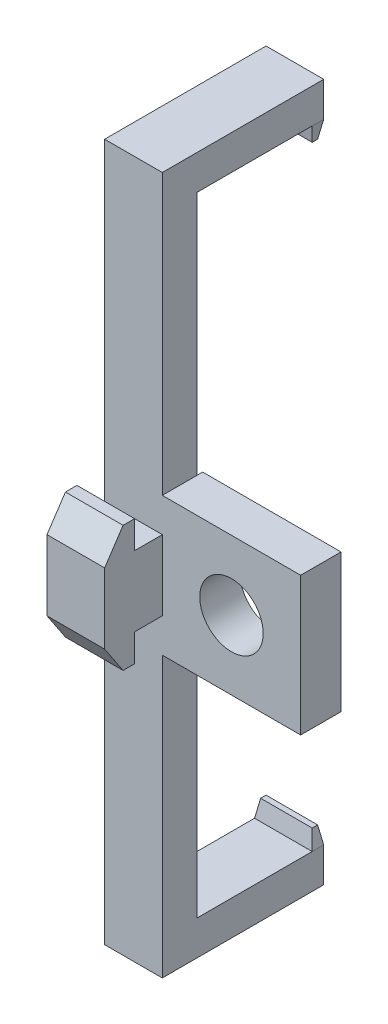
ISO-10303-21;
HEADER;
FILE_DESCRIPTION(('STEP AP214'),'2;1');
FILE_NAME('part.step','',(''),(''),'','','');
FILE_SCHEMA(('AUTOMOTIVE_DESIGN { 1 0 10303 214 1 1 1 1 }'));
ENDSEC;
DATA;
#1=APPLICATION_CONTEXT('core data for automotive mechanical design processes');
#2=APPLICATION_PROTOCOL_DEFINITION('international standard','automotive_design',2000,#1);
#3=PRODUCT_CONTEXT('',#1,'mechanical');
#4=PRODUCT('Part','Part','',(#3));
#5=PRODUCT_RELATED_PRODUCT_CATEGORY('part','',(#4));
#6=PRODUCT_DEFINITION_FORMATION('','',#4);
#7=PRODUCT_DEFINITION_CONTEXT('part definition',#1,'design');
#8=PRODUCT_DEFINITION('design','',#6,#7);
#9=PRODUCT_DEFINITION_SHAPE('','',#8);
#10=(LENGTH_UNIT() NAMED_UNIT(*) SI_UNIT(.MILLI.,.METRE.));
#11=(NAMED_UNIT(*) PLANE_ANGLE_UNIT() SI_UNIT($,.RADIAN.));
#12=(NAMED_UNIT(*) SI_UNIT($,.STERADIAN.) SOLID_ANGLE_UNIT());
#13=UNCERTAINTY_MEASURE_WITH_UNIT(LENGTH_MEASURE(1.E-05),#10,'distance_accuracy_value','');
#14=(GEOMETRIC_REPRESENTATION_CONTEXT(3) GLOBAL_UNCERTAINTY_ASSIGNED_CONTEXT((#13)) GLOBAL_UNIT_ASSIGNED_CONTEXT((#10,
#11,#12)) REPRESENTATION_CONTEXT('',''));
#15=CARTESIAN_POINT('',(0.,0.,0.));
#16=DIRECTION('',(0.,0.,1.));
#17=DIRECTION('',(1.,0.,0.));
#18=AXIS2_PLACEMENT_3D('',#15,#16,#17);
#19=CARTESIAN_POINT('',(-75.5113721841337,0.,3.));
#20=DIRECTION('',(-1.,0.,0.));
#21=DIRECTION('',(0.,0.,1.));
#22=AXIS2_PLACEMENT_3D('',#19,#20,#21);
#23=PLANE('',#22);
#24=DIRECTION('',(0.,0.,-1.));
#25=VECTOR('',#24,1.);
#26=CARTESIAN_POINT('',(-75.5113721841337,-6.,3.));
#27=LINE('',#26,#25);
#28=CARTESIAN_POINT('',(-75.5113721841337,-6.,3.));
#29=VERTEX_POINT('',#28);
#30=CARTESIAN_POINT('',(-75.5113721841337,-6.,0.));
#31=VERTEX_POINT('',#30);
#32=EDGE_CURVE('E256',#29,#31,#27,.T.);
#33=ORIENTED_EDGE('',*,*,#32,.F.);
#34=DIRECTION('',(0.,1.,0.));
#35=VECTOR('',#34,1.);
#36=CARTESIAN_POINT('',(-75.5113721841337,0.,3.));
#37=LINE('',#36,#35);
#38=CARTESIAN_POINT('',(-75.5113721841337,-30.25,3.));
#39=VERTEX_POINT('',#38);
#40=EDGE_CURVE('E439',#39,#29,#37,.T.);
#41=ORIENTED_EDGE('',*,*,#40,.F.);
#42=DIRECTION('',(0.,0.,-1.));
#43=VECTOR('',#42,1.);
#44=CARTESIAN_POINT('',(-75.5113721841337,-30.25,3.));
#45=LINE('',#44,#43);
#46=CARTESIAN_POINT('',(-75.5113721841337,-30.25,-11.));
#47=VERTEX_POINT('',#46);
#48=EDGE_CURVE('E453',#39,#47,#45,.T.);
#49=ORIENTED_EDGE('',*,*,#48,.T.);
#50=DIRECTION('',(0.,-1.,0.));
#51=VECTOR('',#50,1.);
#52=CARTESIAN_POINT('',(-75.5113721841337,0.,-11.));
#53=LINE('',#52,#51);
#54=CARTESIAN_POINT('',(-75.5113721841337,-27.25,-11.));
#55=VERTEX_POINT('',#54);
#56=EDGE_CURVE('E410',#55,#47,#53,.T.);
#57=ORIENTED_EDGE('',*,*,#56,.F.);
#58=DIRECTION('',(0.,0.,1.));
#59=VECTOR('',#58,1.);
#60=CARTESIAN_POINT('',(-75.5113721841337,-27.25,-11.));
#61=LINE('',#60,#59);
#62=CARTESIAN_POINT('',(-75.5113721841337,-27.2500000000001,-10.));
#63=VERTEX_POINT('',#62);
#64=EDGE_CURVE('E430',#55,#63,#61,.T.);
#65=ORIENTED_EDGE('',*,*,#64,.T.);
#66=CARTESIAN_POINT('',(-75.5113721841337,-27.25,0.));
#67=VERTEX_POINT('',#66);
#68=EDGE_CURVE('E422',#63,#67,#61,.T.);
#69=ORIENTED_EDGE('',*,*,#68,.T.);
#70=DIRECTION('',(0.,1.,0.));
#71=VECTOR('',#70,1.);
#72=CARTESIAN_POINT('',(-75.5113721841337,0.,0.));
#73=LINE('',#72,#71);
#74=EDGE_CURVE('E449',#67,#31,#73,.T.);
#75=ORIENTED_EDGE('',*,*,#74,.T.);
#76=EDGE_LOOP('',(#33,#41,#49,#57,#65,#69,#75));
#77=FACE_BOUND('',#76,.T.);
#78=ADVANCED_FACE('F42',(#77),#23,.F.);
#79=DIRECTION('',(0.,-1.,0.));
#80=VECTOR('',#79,1.);
#81=CARTESIAN_POINT('',(-75.5113721841337,6.,3.));
#82=LINE('',#81,#80);
#83=CARTESIAN_POINT('',(-75.5113721841337,3.05,3.));
#84=VERTEX_POINT('',#83);
#85=CARTESIAN_POINT('',(-75.5113721841337,-3.05,3.));
#86=VERTEX_POINT('',#85);
#87=EDGE_CURVE('E11',#84,#86,#82,.T.);
#88=ORIENTED_EDGE('',*,*,#87,.F.);
#89=DIRECTION('',(0.,0.,1.));
#90=VECTOR('',#89,1.);
#91=CARTESIAN_POINT('',(-75.5113721841337,3.05,3.));
#92=LINE('',#91,#90);
#93=CARTESIAN_POINT('',(-75.5113721841337,3.05,5.4));
#94=VERTEX_POINT('',#93);
#95=EDGE_CURVE('E261',#84,#94,#92,.T.);
#96=ORIENTED_EDGE('',*,*,#95,.T.);
#97=DIRECTION('',(0.,1.,0.));
#98=VECTOR('',#97,1.);
#99=CARTESIAN_POINT('',(-75.5113721841337,3.05,5.4));
#100=LINE('',#99,#98);
#101=CARTESIAN_POINT('',(-75.5113721841337,5.45,5.4));
#102=VERTEX_POINT('',#101);
#103=EDGE_CURVE('E264',#94,#102,#100,.T.);
#104=ORIENTED_EDGE('',*,*,#103,.T.);
#105=DIRECTION('',(0.,0.,1.));
#106=VECTOR('',#105,1.);
#107=CARTESIAN_POINT('',(-75.5113721841337,5.45,5.4));
#108=LINE('',#107,#106);
#109=CARTESIAN_POINT('',(-75.5113721841337,5.45,6.4));
#110=VERTEX_POINT('',#109);
#111=EDGE_CURVE('E289',#102,#110,#108,.T.);
#112=ORIENTED_EDGE('',*,*,#111,.T.);
#113=DIRECTION('',(0.,-0.832050294337843,0.55470019622523));
#114=VECTOR('',#113,1.);
#115=CARTESIAN_POINT('',(-75.5113721841337,5.45,6.4));
#116=LINE('',#115,#114);
#117=CARTESIAN_POINT('',(-75.5113721841337,3.05,8.));
#118=VERTEX_POINT('',#117);
#119=EDGE_CURVE('E286',#110,#118,#116,.T.);
#120=ORIENTED_EDGE('',*,*,#119,.T.);
#121=DIRECTION('',(0.,-1.,0.));
#122=VECTOR('',#121,1.);
#123=CARTESIAN_POINT('',(-75.5113721841337,-3.05,8.));
#124=LINE('',#123,#122);
#125=CARTESIAN_POINT('',(-75.5113721841337,-3.05,8.));
#126=VERTEX_POINT('',#125);
#127=EDGE_CURVE('E283',#118,#126,#124,.T.);
#128=ORIENTED_EDGE('',*,*,#127,.T.);
#129=DIRECTION('',(0.,-0.832050294337843,-0.55470019622523));
#130=VECTOR('',#129,1.);
#131=CARTESIAN_POINT('',(-75.5113721841337,-5.45,6.4));
#132=LINE('',#131,#130);
#133=CARTESIAN_POINT('',(-75.5113721841337,-5.45,6.4));
#134=VERTEX_POINT('',#133);
#135=EDGE_CURVE('E280',#126,#134,#132,.T.);
#136=ORIENTED_EDGE('',*,*,#135,.T.);
#137=DIRECTION('',(0.,0.,-1.));
#138=VECTOR('',#137,1.);
#139=CARTESIAN_POINT('',(-75.5113721841337,-5.45,5.4));
#140=LINE('',#139,#138);
#141=CARTESIAN_POINT('',(-75.5113721841337,-5.45,5.4));
#142=VERTEX_POINT('',#141);
#143=EDGE_CURVE('E277',#134,#142,#140,.T.);
#144=ORIENTED_EDGE('',*,*,#143,.T.);
#145=DIRECTION('',(0.,1.,0.));
#146=VECTOR('',#145,1.);
#147=CARTESIAN_POINT('',(-75.5113721841337,-3.05,5.4));
#148=LINE('',#147,#146);
#149=CARTESIAN_POINT('',(-75.5113721841337,-3.05,5.4));
#150=VERTEX_POINT('',#149);
#151=EDGE_CURVE('E274',#142,#150,#148,.T.);
#152=ORIENTED_EDGE('',*,*,#151,.T.);
#153=DIRECTION('',(0.,0.,-1.));
#154=VECTOR('',#153,1.);
#155=CARTESIAN_POINT('',(-75.5113721841337,-3.05,3.));
#156=LINE('',#155,#154);
#157=EDGE_CURVE('E270',#150,#86,#156,.T.);
#158=ORIENTED_EDGE('',*,*,#157,.T.);
#159=EDGE_LOOP('',(#88,#96,#104,#112,#120,#128,#136,#144,#152,#158));
#160=FACE_BOUND('',#159,.T.);
#161=ADVANCED_FACE('F541',(#160),#23,.F.);
#162=DIRECTION('',(0.,0.,1.));
#163=VECTOR('',#162,1.);
#164=CARTESIAN_POINT('',(-75.5113721841337,6.,3.));
#165=LINE('',#164,#163);
#166=CARTESIAN_POINT('',(-75.5113721841337,6.,0.));
#167=VERTEX_POINT('',#166);
#168=CARTESIAN_POINT('',(-75.5113721841337,6.,3.));
#169=VERTEX_POINT('',#168);
#170=EDGE_CURVE('E51',#167,#169,#165,.T.);
#171=ORIENTED_EDGE('',*,*,#170,.F.);
#172=CARTESIAN_POINT('',(-75.5113721841337,27.25,0.));
#173=VERTEX_POINT('',#172);
#174=EDGE_CURVE('E448',#167,#173,#73,.T.);
#175=ORIENTED_EDGE('',*,*,#174,.T.);
#176=DIRECTION('',(0.,0.,1.));
#177=VECTOR('',#176,1.);
#178=CARTESIAN_POINT('',(-75.5113721841337,27.25,-11.));
#179=LINE('',#178,#177);
#180=CARTESIAN_POINT('',(-75.5113721841337,27.2500000000001,-10.));
#181=VERTEX_POINT('',#180);
#182=EDGE_CURVE('E406',#181,#173,#179,.T.);
#183=ORIENTED_EDGE('',*,*,#182,.F.);
#184=CARTESIAN_POINT('',(-75.5113721841337,27.2500000000001,-11.));
#185=VERTEX_POINT('',#184);
#186=EDGE_CURVE('E402',#185,#181,#179,.T.);
#187=ORIENTED_EDGE('',*,*,#186,.F.);
#188=DIRECTION('',(0.,-1.,0.));
#189=VECTOR('',#188,1.);
#190=CARTESIAN_POINT('',(-75.5113721841337,0.,-11.));
#191=LINE('',#190,#189);
#192=CARTESIAN_POINT('',(-75.5113721841337,30.25,-11.));
#193=VERTEX_POINT('',#192);
#194=EDGE_CURVE('E396',#193,#185,#191,.T.);
#195=ORIENTED_EDGE('',*,*,#194,.F.);
#196=DIRECTION('',(0.,0.,-1.));
#197=VECTOR('',#196,1.);
#198=CARTESIAN_POINT('',(-75.5113721841337,30.25,3.));
#199=LINE('',#198,#197);
#200=CARTESIAN_POINT('',(-75.5113721841337,30.25,3.));
#201=VERTEX_POINT('',#200);
#202=EDGE_CURVE('E452',#201,#193,#199,.T.);
#203=ORIENTED_EDGE('',*,*,#202,.F.);
#204=EDGE_CURVE('E438',#169,#201,#37,.T.);
#205=ORIENTED_EDGE('',*,*,#204,.F.);
#206=EDGE_LOOP('',(#171,#175,#183,#187,#195,#203,#205));
#207=FACE_BOUND('',#206,.T.);
#208=ADVANCED_FACE('F497',(#207),#23,.F.);
#209=CARTESIAN_POINT('',(0.,-27.2500000000001,-11.));
#210=DIRECTION('',(0.,-1.,0.));
#211=DIRECTION('',(1.,0.,0.));
#212=AXIS2_PLACEMENT_3D('',#209,#210,#211);
#213=PLANE('',#212);
#214=DIRECTION('',(1.,0.,0.));
#215=VECTOR('',#214,1.);
#216=CARTESIAN_POINT('',(-80.5113721841337,-27.2500000000001,-10.));
#217=LINE('',#216,#215);
#218=CARTESIAN_POINT('',(-80.5113721841337,-27.2500000000001,-10.));
#219=VERTEX_POINT('',#218);
#220=EDGE_CURVE('E348',#219,#63,#217,.T.);
#221=ORIENTED_EDGE('',*,*,#220,.F.);
#222=DIRECTION('',(0.,0.,1.));
#223=VECTOR('',#222,1.);
#224=CARTESIAN_POINT('',(-80.5113721841337,-27.25,-11.));
#225=LINE('',#224,#223);
#226=CARTESIAN_POINT('',(-80.5113721841337,-27.25,0.));
#227=VERTEX_POINT('',#226);
#228=EDGE_CURVE('E429',#219,#227,#225,.T.);
#229=ORIENTED_EDGE('',*,*,#228,.T.);
#230=DIRECTION('',(1.,0.,0.));
#231=VECTOR('',#230,1.);
#232=CARTESIAN_POINT('',(0.,-27.2500000000001,0.));
#233=LINE('',#232,#231);
#234=EDGE_CURVE('E405',#227,#67,#233,.T.);
#235=ORIENTED_EDGE('',*,*,#234,.T.);
#236=ORIENTED_EDGE('',*,*,#68,.F.);
#237=EDGE_LOOP('',(#221,#229,#235,#236));
#238=FACE_BOUND('',#237,.T.);
#239=ADVANCED_FACE('F548',(#238),#213,.F.);
#240=CARTESIAN_POINT('',(0.,0.,0.));
#241=DIRECTION('',(0.,0.,1.));
#242=DIRECTION('',(1.,0.,0.));
#243=AXIS2_PLACEMENT_3D('',#240,#241,#242);
#244=PLANE('',#243);
#245=DIRECTION('',(-1.,0.,0.));
#246=VECTOR('',#245,1.);
#247=CARTESIAN_POINT('',(0.,27.2500000000001,0.));
#248=LINE('',#247,#246);
#249=CARTESIAN_POINT('',(-80.5113721841337,27.25,0.));
#250=VERTEX_POINT('',#249);
#251=EDGE_CURVE('E370',#173,#250,#248,.T.);
#252=ORIENTED_EDGE('',*,*,#251,.F.);
#253=ORIENTED_EDGE('',*,*,#174,.F.);
#254=EDGE_CURVE('E65',#31,#167,#73,.T.);
#255=ORIENTED_EDGE('',*,*,#254,.F.);
#256=ORIENTED_EDGE('',*,*,#74,.F.);
#257=ORIENTED_EDGE('',*,*,#234,.F.);
#258=DIRECTION('',(0.,1.,0.));
#259=VECTOR('',#258,1.);
#260=CARTESIAN_POINT('',(-80.5113721841337,0.,0.));
#261=LINE('',#260,#259);
#262=EDGE_CURVE('E428',#227,#250,#261,.T.);
#263=ORIENTED_EDGE('',*,*,#262,.T.);
#264=EDGE_LOOP('',(#252,#253,#255,#256,#257,#263));
#265=FACE_BOUND('',#264,.T.);
#266=ADVANCED_FACE('F504',(#265),#244,.F.);
#267=CARTESIAN_POINT('',(-80.5113721841337,0.,3.));
#268=DIRECTION('',(-1.,0.,0.));
#269=DIRECTION('',(0.,0.,1.));
#270=AXIS2_PLACEMENT_3D('',#267,#268,#269);
#271=PLANE('',#270);
#272=DIRECTION('',(0.,1.,0.));
#273=VECTOR('',#272,1.);
#274=CARTESIAN_POINT('',(-80.5113721841337,0.,3.));
#275=LINE('',#274,#273);
#276=CARTESIAN_POINT('',(-80.5113721841337,-30.25,3.));
#277=VERTEX_POINT('',#276);
#278=CARTESIAN_POINT('',(-80.5113721841337,-3.05,3.));
#279=VERTEX_POINT('',#278);
#280=EDGE_CURVE('E433',#277,#279,#275,.T.);
#281=ORIENTED_EDGE('',*,*,#280,.T.);
#282=DIRECTION('',(0.,0.,-1.));
#283=VECTOR('',#282,1.);
#284=CARTESIAN_POINT('',(-80.5113721841337,-3.05,3.));
#285=LINE('',#284,#283);
#286=CARTESIAN_POINT('',(-80.5113721841337,-3.05,5.4));
#287=VERTEX_POINT('',#286);
#288=EDGE_CURVE('E294',#287,#279,#285,.T.);
#289=ORIENTED_EDGE('',*,*,#288,.F.);
#290=DIRECTION('',(0.,1.,0.));
#291=VECTOR('',#290,1.);
#292=CARTESIAN_POINT('',(-80.5113721841337,-3.05,5.4));
#293=LINE('',#292,#291);
#294=CARTESIAN_POINT('',(-80.5113721841337,-5.45,5.4));
#295=VERTEX_POINT('',#294);
#296=EDGE_CURVE('E299',#295,#287,#293,.T.);
#297=ORIENTED_EDGE('',*,*,#296,.F.);
#298=DIRECTION('',(0.,0.,-1.));
#299=VECTOR('',#298,1.);
#300=CARTESIAN_POINT('',(-80.5113721841337,-5.45,5.4));
#301=LINE('',#300,#299);
#302=CARTESIAN_POINT('',(-80.5113721841337,-5.45,6.4));
#303=VERTEX_POINT('',#302);
#304=EDGE_CURVE('E303',#303,#295,#301,.T.);
#305=ORIENTED_EDGE('',*,*,#304,.F.);
#306=DIRECTION('',(0.,-0.832050294337843,-0.55470019622523));
#307=VECTOR('',#306,1.);
#308=CARTESIAN_POINT('',(-80.5113721841337,-5.45,6.4));
#309=LINE('',#308,#307);
#310=CARTESIAN_POINT('',(-80.5113721841337,-3.05,8.));
#311=VERTEX_POINT('',#310);
#312=EDGE_CURVE('E307',#311,#303,#309,.T.);
#313=ORIENTED_EDGE('',*,*,#312,.F.);
#314=DIRECTION('',(0.,-1.,0.));
#315=VECTOR('',#314,1.);
#316=CARTESIAN_POINT('',(-80.5113721841337,-3.05,8.));
#317=LINE('',#316,#315);
#318=CARTESIAN_POINT('',(-80.5113721841337,3.05,8.));
#319=VERTEX_POINT('',#318);
#320=EDGE_CURVE('E311',#319,#311,#317,.T.);
#321=ORIENTED_EDGE('',*,*,#320,.F.);
#322=DIRECTION('',(0.,-0.832050294337843,0.55470019622523));
#323=VECTOR('',#322,1.);
#324=CARTESIAN_POINT('',(-80.5113721841337,5.45,6.4));
#325=LINE('',#324,#323);
#326=CARTESIAN_POINT('',(-80.5113721841337,5.45,6.4));
#327=VERTEX_POINT('',#326);
#328=EDGE_CURVE('E315',#327,#319,#325,.T.);
#329=ORIENTED_EDGE('',*,*,#328,.F.);
#330=DIRECTION('',(0.,0.,1.));
#331=VECTOR('',#330,1.);
#332=CARTESIAN_POINT('',(-80.5113721841337,5.45,5.4));
#333=LINE('',#332,#331);
#334=CARTESIAN_POINT('',(-80.5113721841337,5.45,5.4));
#335=VERTEX_POINT('',#334);
#336=EDGE_CURVE('E319',#335,#327,#333,.T.);
#337=ORIENTED_EDGE('',*,*,#336,.F.);
#338=DIRECTION('',(0.,1.,0.));
#339=VECTOR('',#338,1.);
#340=CARTESIAN_POINT('',(-80.5113721841337,3.05,5.4));
#341=LINE('',#340,#339);
#342=CARTESIAN_POINT('',(-80.5113721841337,3.05,5.4));
#343=VERTEX_POINT('',#342);
#344=EDGE_CURVE('E323',#343,#335,#341,.T.);
#345=ORIENTED_EDGE('',*,*,#344,.F.);
#346=DIRECTION('',(0.,0.,1.));
#347=VECTOR('',#346,1.);
#348=CARTESIAN_POINT('',(-80.5113721841337,3.05,3.));
#349=LINE('',#348,#347);
#350=CARTESIAN_POINT('',(-80.5113721841337,3.05,3.));
#351=VERTEX_POINT('',#350);
#352=EDGE_CURVE('E327',#351,#343,#349,.T.);
#353=ORIENTED_EDGE('',*,*,#352,.F.);
#354=CARTESIAN_POINT('',(-80.5113721841337,30.25,3.));
#355=VERTEX_POINT('',#354);
#356=EDGE_CURVE('E436',#351,#355,#275,.T.);
#357=ORIENTED_EDGE('',*,*,#356,.T.);
#358=DIRECTION('',(0.,0.,-1.));
#359=VECTOR('',#358,1.);
#360=CARTESIAN_POINT('',(-80.5113721841337,30.25,3.));
#361=LINE('',#360,#359);
#362=CARTESIAN_POINT('',(-80.5113721841337,30.25,-11.));
#363=VERTEX_POINT('',#362);
#364=EDGE_CURVE('E445',#355,#363,#361,.T.);
#365=ORIENTED_EDGE('',*,*,#364,.T.);
#366=DIRECTION('',(0.,-1.,0.));
#367=VECTOR('',#366,1.);
#368=CARTESIAN_POINT('',(-80.5113721841337,0.,-11.));
#369=LINE('',#368,#367);
#370=CARTESIAN_POINT('',(-80.5113721841337,27.25,-11.));
#371=VERTEX_POINT('',#370);
#372=EDGE_CURVE('E390',#363,#371,#369,.T.);
#373=ORIENTED_EDGE('',*,*,#372,.T.);
#374=DIRECTION('',(0.,0.,1.));
#375=VECTOR('',#374,1.);
#376=CARTESIAN_POINT('',(-80.5113721841337,27.25,-11.));
#377=LINE('',#376,#375);
#378=CARTESIAN_POINT('',(-80.5113721841337,27.2500000000001,-10.));
#379=VERTEX_POINT('',#378);
#380=EDGE_CURVE('E407',#371,#379,#377,.T.);
#381=ORIENTED_EDGE('',*,*,#380,.T.);
#382=EDGE_CURVE('E399',#379,#250,#377,.T.);
#383=ORIENTED_EDGE('',*,*,#382,.T.);
#384=ORIENTED_EDGE('',*,*,#262,.F.);
#385=ORIENTED_EDGE('',*,*,#228,.F.);
#386=CARTESIAN_POINT('',(-80.5113721841337,-27.2500000000001,-11.));
#387=VERTEX_POINT('',#386);
#388=EDGE_CURVE('E425',#387,#219,#225,.T.);
#389=ORIENTED_EDGE('',*,*,#388,.F.);
#390=DIRECTION('',(0.,-1.,0.));
#391=VECTOR('',#390,1.);
#392=CARTESIAN_POINT('',(-80.5113721841337,0.,-11.));
#393=LINE('',#392,#391);
#394=CARTESIAN_POINT('',(-80.5113721841337,-30.25,-11.));
#395=VERTEX_POINT('',#394);
#396=EDGE_CURVE('E416',#387,#395,#393,.T.);
#397=ORIENTED_EDGE('',*,*,#396,.T.);
#398=DIRECTION('',(0.,0.,-1.));
#399=VECTOR('',#398,1.);
#400=CARTESIAN_POINT('',(-80.5113721841337,-30.25,3.));
#401=LINE('',#400,#399);
#402=EDGE_CURVE('E46',#277,#395,#401,.T.);
#403=ORIENTED_EDGE('',*,*,#402,.F.);
#404=EDGE_LOOP('',(#281,#289,#297,#305,#313,#321,#329,#337,#345,#353,#357,#365,#373,#381,#383,
#384,#385,#389,#397,#403));
#405=FACE_BOUND('',#404,.T.);
#406=ADVANCED_FACE('F44',(#405),#271,.T.);
#407=CARTESIAN_POINT('',(0.,-30.25,3.));
#408=DIRECTION('',(0.,1.,0.));
#409=DIRECTION('',(0.,0.,1.));
#410=AXIS2_PLACEMENT_3D('',#407,#408,#409);
#411=PLANE('',#410);
#412=ORIENTED_EDGE('',*,*,#402,.T.);
#413=DIRECTION('',(1.,0.,0.));
#414=VECTOR('',#413,1.);
#415=CARTESIAN_POINT('',(0.,-30.25,-11.));
#416=LINE('',#415,#414);
#417=EDGE_CURVE('E419',#395,#47,#416,.T.);
#418=ORIENTED_EDGE('',*,*,#417,.T.);
#419=ORIENTED_EDGE('',*,*,#48,.F.);
#420=DIRECTION('',(1.,0.,0.));
#421=VECTOR('',#420,1.);
#422=CARTESIAN_POINT('',(0.,-30.25,3.));
#423=LINE('',#422,#421);
#424=EDGE_CURVE('E435',#277,#39,#423,.T.);
#425=ORIENTED_EDGE('',*,*,#424,.F.);
#426=EDGE_LOOP('',(#412,#418,#419,#425));
#427=FACE_BOUND('',#426,.T.);
#428=ADVANCED_FACE('F560',(#427),#411,.F.);
#429=CARTESIAN_POINT('',(0.,30.25,3.));
#430=DIRECTION('',(0.,-1.,0.));
#431=DIRECTION('',(0.,0.,-1.));
#432=AXIS2_PLACEMENT_3D('',#429,#430,#431);
#433=PLANE('',#432);
#434=ORIENTED_EDGE('',*,*,#202,.T.);
#435=DIRECTION('',(-1.,0.,0.));
#436=VECTOR('',#435,1.);
#437=CARTESIAN_POINT('',(0.,30.25,-11.));
#438=LINE('',#437,#436);
#439=EDGE_CURVE('E387',#193,#363,#438,.T.);
#440=ORIENTED_EDGE('',*,*,#439,.T.);
#441=ORIENTED_EDGE('',*,*,#364,.F.);
#442=DIRECTION('',(-1.,0.,0.));
#443=VECTOR('',#442,1.);
#444=CARTESIAN_POINT('',(0.,30.25,3.));
#445=LINE('',#444,#443);
#446=EDGE_CURVE('E442',#201,#355,#445,.T.);
#447=ORIENTED_EDGE('',*,*,#446,.F.);
#448=EDGE_LOOP('',(#434,#440,#441,#447));
#449=FACE_BOUND('',#448,.T.);
#450=ADVANCED_FACE('F483',(#449),#433,.F.);
#451=CARTESIAN_POINT('',(0.,0.,3.));
#452=DIRECTION('',(0.,0.,1.));
#453=DIRECTION('',(1.,0.,0.));
#454=AXIS2_PLACEMENT_3D('',#451,#452,#453);
#455=PLANE('',#454);
#456=CARTESIAN_POINT('',(-69.5113721841337,0.,3.));
#457=DIRECTION('',(0.,0.,1.));
#458=DIRECTION('',(1.,0.,0.));
#459=AXIS2_PLACEMENT_3D('',#456,#457,#458);
#460=CIRCLE('',#459,2.75000000000001);
#461=CARTESIAN_POINT('',(-66.7613721841337,0.,3.));
#462=VERTEX_POINT('',#461);
#463=EDGE_CURVE('E467',#462,#462,#460,.T.);
#464=ORIENTED_EDGE('',*,*,#463,.F.);
#465=EDGE_LOOP('',(#464));
#466=FACE_BOUND('',#465,.T.);
#467=ORIENTED_EDGE('',*,*,#40,.T.);
#468=DIRECTION('',(-1.,0.,0.));
#469=VECTOR('',#468,1.);
#470=CARTESIAN_POINT('',(-63.5113721841337,-6.,3.));
#471=LINE('',#470,#469);
#472=CARTESIAN_POINT('',(-63.5113721841337,-6.,3.));
#473=VERTEX_POINT('',#472);
#474=EDGE_CURVE('E266',#473,#29,#471,.T.);
#475=ORIENTED_EDGE('',*,*,#474,.F.);
#476=DIRECTION('',(0.,-1.,0.));
#477=VECTOR('',#476,1.);
#478=CARTESIAN_POINT('',(-63.5113721841337,6.,3.));
#479=LINE('',#478,#477);
#480=CARTESIAN_POINT('',(-63.5113721841337,6.,3.));
#481=VERTEX_POINT('',#480);
#482=EDGE_CURVE('E246',#481,#473,#479,.T.);
#483=ORIENTED_EDGE('',*,*,#482,.F.);
#484=DIRECTION('',(-1.,0.,0.));
#485=VECTOR('',#484,1.);
#486=CARTESIAN_POINT('',(-63.5113721841337,6.,3.));
#487=LINE('',#486,#485);
#488=EDGE_CURVE('E243',#481,#169,#487,.T.);
#489=ORIENTED_EDGE('',*,*,#488,.T.);
#490=ORIENTED_EDGE('',*,*,#204,.T.);
#491=ORIENTED_EDGE('',*,*,#446,.T.);
#492=ORIENTED_EDGE('',*,*,#356,.F.);
#493=DIRECTION('',(1.,0.,0.));
#494=VECTOR('',#493,1.);
#495=CARTESIAN_POINT('',(-100.436231029305,3.05,3.));
#496=LINE('',#495,#494);
#497=EDGE_CURVE('E273',#351,#84,#496,.T.);
#498=ORIENTED_EDGE('',*,*,#497,.T.);
#499=ORIENTED_EDGE('',*,*,#87,.T.);
#500=DIRECTION('',(1.,0.,0.));
#501=VECTOR('',#500,1.);
#502=CARTESIAN_POINT('',(-100.436231029305,-3.05,3.));
#503=LINE('',#502,#501);
#504=EDGE_CURVE('E297',#279,#86,#503,.T.);
#505=ORIENTED_EDGE('',*,*,#504,.F.);
#506=ORIENTED_EDGE('',*,*,#280,.F.);
#507=ORIENTED_EDGE('',*,*,#424,.T.);
#508=EDGE_LOOP('',(#467,#475,#483,#489,#490,#491,#492,#498,#499,#505,#506,#507));
#509=FACE_BOUND('',#508,.T.);
#510=ADVANCED_FACE('F479',(#466,#509),#455,.T.);
#511=CARTESIAN_POINT('',(0.,0.,-11.));
#512=DIRECTION('',(0.,0.,1.));
#513=DIRECTION('',(1.,0.,0.));
#514=AXIS2_PLACEMENT_3D('',#511,#512,#513);
#515=PLANE('',#514);
#516=ORIENTED_EDGE('',*,*,#56,.T.);
#517=ORIENTED_EDGE('',*,*,#417,.F.);
#518=ORIENTED_EDGE('',*,*,#396,.F.);
#519=DIRECTION('',(1.,0.,0.));
#520=VECTOR('',#519,1.);
#521=CARTESIAN_POINT('',(0.,-27.2500000000001,-11.));
#522=LINE('',#521,#520);
#523=EDGE_CURVE('E413',#387,#55,#522,.T.);
#524=ORIENTED_EDGE('',*,*,#523,.T.);
#525=EDGE_LOOP('',(#516,#517,#518,#524));
#526=FACE_BOUND('',#525,.T.);
#527=ADVANCED_FACE('F482',(#526),#515,.F.);
#528=CARTESIAN_POINT('',(0.,27.2500000000001,-11.));
#529=DIRECTION('',(0.,1.,0.));
#530=DIRECTION('',(-1.,0.,0.));
#531=AXIS2_PLACEMENT_3D('',#528,#529,#530);
#532=PLANE('',#531);
#533=ORIENTED_EDGE('',*,*,#382,.F.);
#534=DIRECTION('',(1.,0.,0.));
#535=VECTOR('',#534,1.);
#536=CARTESIAN_POINT('',(-80.5113721841337,27.2500000000001,-10.));
#537=LINE('',#536,#535);
#538=EDGE_CURVE('E331',#379,#181,#537,.T.);
#539=ORIENTED_EDGE('',*,*,#538,.T.);
#540=ORIENTED_EDGE('',*,*,#182,.T.);
#541=ORIENTED_EDGE('',*,*,#251,.T.);
#542=EDGE_LOOP('',(#533,#539,#540,#541));
#543=FACE_BOUND('',#542,.T.);
#544=ADVANCED_FACE('F502',(#543),#532,.F.);
#545=CARTESIAN_POINT('',(0.,0.,-11.));
#546=DIRECTION('',(0.,0.,1.));
#547=DIRECTION('',(1.,0.,0.));
#548=AXIS2_PLACEMENT_3D('',#545,#546,#547);
#549=PLANE('',#548);
#550=ORIENTED_EDGE('',*,*,#439,.F.);
#551=ORIENTED_EDGE('',*,*,#194,.T.);
#552=DIRECTION('',(-1.,0.,0.));
#553=VECTOR('',#552,1.);
#554=CARTESIAN_POINT('',(0.,27.2500000000001,-11.));
#555=LINE('',#554,#553);
#556=EDGE_CURVE('E393',#185,#371,#555,.T.);
#557=ORIENTED_EDGE('',*,*,#556,.T.);
#558=ORIENTED_EDGE('',*,*,#372,.F.);
#559=EDGE_LOOP('',(#550,#551,#557,#558));
#560=FACE_BOUND('',#559,.T.);
#561=ADVANCED_FACE('F520',(#560),#549,.F.);
#562=CARTESIAN_POINT('',(-80.5113721841337,-27.2500000000001,-11.));
#563=DIRECTION('',(-0.984807753012208,0.173648177666931,0.));
#564=DIRECTION('',(-0.173648177666931,-0.984807753012208,0.));
#565=AXIS2_PLACEMENT_3D('',#562,#563,#564);
#566=PLANE('',#565);
#567=ORIENTED_EDGE('',*,*,#388,.T.);
#568=DIRECTION('',(-0.171087869746036,-0.970287525247814,0.171087869746036));
#569=VECTOR('',#568,1.);
#570=CARTESIAN_POINT('',(-80.5113721841337,-27.2500000000001,-10.));
#571=LINE('',#570,#569);
#572=CARTESIAN_POINT('',(-80.246881713071,-25.7500000000001,-10.2644904710627));
#573=VERTEX_POINT('',#572);
#574=EDGE_CURVE('E368',#573,#219,#571,.T.);
#575=ORIENTED_EDGE('',*,*,#574,.F.);
#576=DIRECTION('',(0.,0.,-1.));
#577=VECTOR('',#576,1.);
#578=CARTESIAN_POINT('',(-80.246881713071,-25.7500000000001,-11.));
#579=LINE('',#578,#577);
#580=CARTESIAN_POINT('',(-80.246881713071,-25.7500000000001,-10.7355095289373));
#581=VERTEX_POINT('',#580);
#582=EDGE_CURVE('E367',#581,#573,#579,.F.);
#583=ORIENTED_EDGE('',*,*,#582,.F.);
#584=DIRECTION('',(-0.171087869746036,-0.970287525247814,-0.171087869746036));
#585=VECTOR('',#584,1.);
#586=CARTESIAN_POINT('',(-80.5113721841337,-27.2500000000001,-11.));
#587=LINE('',#586,#585);
#588=EDGE_CURVE('E372',#581,#387,#587,.T.);
#589=ORIENTED_EDGE('',*,*,#588,.T.);
#590=EDGE_LOOP('',(#567,#575,#583,#589));
#591=FACE_BOUND('',#590,.T.);
#592=ADVANCED_FACE('F594',(#591),#566,.T.);
#593=CARTESIAN_POINT('',(-80.5113721841337,-27.2500000000001,-10.));
#594=DIRECTION('',(0.,0.173648177666931,0.984807753012208));
#595=DIRECTION('',(0.,-0.984807753012208,0.173648177666931));
#596=AXIS2_PLACEMENT_3D('',#593,#594,#595);
#597=PLANE('',#596);
#598=ORIENTED_EDGE('',*,*,#220,.T.);
#599=DIRECTION('',(0.171087869746036,-0.970287525247814,0.171087869746036));
#600=VECTOR('',#599,1.);
#601=CARTESIAN_POINT('',(-75.540643243308,-27.0839955742643,-10.0292710591742));
#602=LINE('',#601,#600);
#603=CARTESIAN_POINT('',(-75.7758626551964,-25.7500000000001,-10.2644904710627));
#604=VERTEX_POINT('',#603);
#605=EDGE_CURVE('E371',#604,#63,#602,.T.);
#606=ORIENTED_EDGE('',*,*,#605,.F.);
#607=DIRECTION('',(-1.,0.,0.));
#608=VECTOR('',#607,1.);
#609=CARTESIAN_POINT('',(-80.5113721841337,-25.7500000000001,-10.2644904710627));
#610=LINE('',#609,#608);
#611=EDGE_CURVE('E382',#573,#604,#610,.F.);
#612=ORIENTED_EDGE('',*,*,#611,.F.);
#613=ORIENTED_EDGE('',*,*,#574,.T.);
#614=EDGE_LOOP('',(#598,#606,#612,#613));
#615=FACE_BOUND('',#614,.T.);
#616=ADVANCED_FACE('F590',(#615),#597,.T.);
#617=CARTESIAN_POINT('',(-75.5113721841337,-27.2500000000001,-11.));
#618=DIRECTION('',(0.984807753012208,0.173648177666931,0.));
#619=DIRECTION('',(-0.173648177666931,0.984807753012208,0.));
#620=AXIS2_PLACEMENT_3D('',#617,#618,#619);
#621=PLANE('',#620);
#622=ORIENTED_EDGE('',*,*,#64,.F.);
#623=DIRECTION('',(0.171087869746036,-0.970287525247814,-0.171087869746036));
#624=VECTOR('',#623,1.);
#625=CARTESIAN_POINT('',(-75.6577274800049,-26.419977871321,-10.8536447041288));
#626=LINE('',#625,#624);
#627=CARTESIAN_POINT('',(-75.7758626551964,-25.7500000000001,-10.7355095289373));
#628=VERTEX_POINT('',#627);
#629=EDGE_CURVE('E375',#628,#55,#626,.T.);
#630=ORIENTED_EDGE('',*,*,#629,.F.);
#631=DIRECTION('',(0.,0.,1.));
#632=VECTOR('',#631,1.);
#633=CARTESIAN_POINT('',(-75.7758626551964,-25.7500000000001,-11.));
#634=LINE('',#633,#632);
#635=EDGE_CURVE('E384',#604,#628,#634,.F.);
#636=ORIENTED_EDGE('',*,*,#635,.F.);
#637=ORIENTED_EDGE('',*,*,#605,.T.);
#638=EDGE_LOOP('',(#622,#630,#636,#637));
#639=FACE_BOUND('',#638,.T.);
#640=ADVANCED_FACE('F585',(#639),#621,.T.);
#641=CARTESIAN_POINT('',(-80.5113721841337,-27.2500000000001,-11.));
#642=DIRECTION('',(0.,0.173648177666931,-0.984807753012208));
#643=DIRECTION('',(0.,0.984807753012208,0.173648177666931));
#644=AXIS2_PLACEMENT_3D('',#641,#642,#643);
#645=PLANE('',#644);
#646=ORIENTED_EDGE('',*,*,#523,.F.);
#647=ORIENTED_EDGE('',*,*,#588,.F.);
#648=DIRECTION('',(1.,0.,0.));
#649=VECTOR('',#648,1.);
#650=CARTESIAN_POINT('',(-80.5113721841337,-25.7500000000001,-10.7355095289373));
#651=LINE('',#650,#649);
#652=EDGE_CURVE('E376',#628,#581,#651,.F.);
#653=ORIENTED_EDGE('',*,*,#652,.F.);
#654=ORIENTED_EDGE('',*,*,#629,.T.);
#655=EDGE_LOOP('',(#646,#647,#653,#654));
#656=FACE_BOUND('',#655,.T.);
#657=ADVANCED_FACE('F597',(#656),#645,.T.);
#658=CARTESIAN_POINT('',(0.,-25.7500000000001,0.));
#659=DIRECTION('',(0.,1.,0.));
#660=DIRECTION('',(0.,0.,1.));
#661=AXIS2_PLACEMENT_3D('',#658,#659,#660);
#662=PLANE('',#661);
#663=ORIENTED_EDGE('',*,*,#582,.T.);
#664=ORIENTED_EDGE('',*,*,#611,.T.);
#665=ORIENTED_EDGE('',*,*,#635,.T.);
#666=ORIENTED_EDGE('',*,*,#652,.T.);
#667=EDGE_LOOP('',(#663,#664,#665,#666));
#668=FACE_BOUND('',#667,.T.);
#669=ADVANCED_FACE('F599',(#668),#662,.T.);
#670=CARTESIAN_POINT('',(-80.5113721841337,27.2500000000001,-11.));
#671=DIRECTION('',(-0.984807753012208,-0.173648177666931,0.));
#672=DIRECTION('',(0.173648177666931,-0.984807753012208,0.));
#673=AXIS2_PLACEMENT_3D('',#670,#671,#672);
#674=PLANE('',#673);
#675=ORIENTED_EDGE('',*,*,#380,.F.);
#676=DIRECTION('',(-0.171087869746036,0.970287525247814,-0.171087869746036));
#677=VECTOR('',#676,1.);
#678=CARTESIAN_POINT('',(-80.5113721841337,27.2500000000001,-11.));
#679=LINE('',#678,#677);
#680=CARTESIAN_POINT('',(-80.246881713071,25.7500000000001,-10.7355095289373));
#681=VERTEX_POINT('',#680);
#682=EDGE_CURVE('E345',#681,#371,#679,.T.);
#683=ORIENTED_EDGE('',*,*,#682,.F.);
#684=DIRECTION('',(0.,0.,1.));
#685=VECTOR('',#684,1.);
#686=CARTESIAN_POINT('',(-80.246881713071,25.7500000000001,-11.));
#687=LINE('',#686,#685);
#688=CARTESIAN_POINT('',(-80.246881713071,25.7500000000001,-10.2644904710627));
#689=VERTEX_POINT('',#688);
#690=EDGE_CURVE('E344',#681,#689,#687,.T.);
#691=ORIENTED_EDGE('',*,*,#690,.T.);
#692=DIRECTION('',(-0.171087869746036,0.970287525247814,0.171087869746036));
#693=VECTOR('',#692,1.);
#694=CARTESIAN_POINT('',(-80.4821011249595,27.0839955742643,-10.0292710591742));
#695=LINE('',#694,#693);
#696=EDGE_CURVE('E350',#689,#379,#695,.T.);
#697=ORIENTED_EDGE('',*,*,#696,.T.);
#698=EDGE_LOOP('',(#675,#683,#691,#697));
#699=FACE_BOUND('',#698,.T.);
#700=ADVANCED_FACE('F512',(#699),#674,.T.);
#701=CARTESIAN_POINT('',(-80.5113721841337,27.2500000000001,-11.));
#702=DIRECTION('',(0.,-0.173648177666931,-0.984807753012208));
#703=DIRECTION('',(0.,0.984807753012208,-0.173648177666931));
#704=AXIS2_PLACEMENT_3D('',#701,#702,#703);
#705=PLANE('',#704);
#706=ORIENTED_EDGE('',*,*,#556,.F.);
#707=DIRECTION('',(0.171087869746036,0.970287525247814,-0.171087869746036));
#708=VECTOR('',#707,1.);
#709=CARTESIAN_POINT('',(-75.5113721841337,27.2500000000001,-11.));
#710=LINE('',#709,#708);
#711=CARTESIAN_POINT('',(-75.7758626551964,25.7500000000001,-10.7355095289373));
#712=VERTEX_POINT('',#711);
#713=EDGE_CURVE('E349',#712,#185,#710,.T.);
#714=ORIENTED_EDGE('',*,*,#713,.F.);
#715=DIRECTION('',(-1.,0.,0.));
#716=VECTOR('',#715,1.);
#717=CARTESIAN_POINT('',(-80.5113721841337,25.7500000000001,-10.7355095289373));
#718=LINE('',#717,#716);
#719=EDGE_CURVE('E358',#712,#681,#718,.T.);
#720=ORIENTED_EDGE('',*,*,#719,.T.);
#721=ORIENTED_EDGE('',*,*,#682,.T.);
#722=EDGE_LOOP('',(#706,#714,#720,#721));
#723=FACE_BOUND('',#722,.T.);
#724=ADVANCED_FACE('F516',(#723),#705,.T.);
#725=CARTESIAN_POINT('',(-75.5113721841337,27.2500000000001,-11.));
#726=DIRECTION('',(0.984807753012208,-0.173648177666931,0.));
#727=DIRECTION('',(0.173648177666931,0.984807753012208,0.));
#728=AXIS2_PLACEMENT_3D('',#725,#726,#727);
#729=PLANE('',#728);
#730=ORIENTED_EDGE('',*,*,#186,.T.);
#731=DIRECTION('',(0.171087869746036,0.970287525247814,0.171087869746036));
#732=VECTOR('',#731,1.);
#733=CARTESIAN_POINT('',(-75.6577274800049,26.419977871321,-10.1463552958712));
#734=LINE('',#733,#732);
#735=CARTESIAN_POINT('',(-75.7758626551964,25.7500000000001,-10.2644904710627));
#736=VERTEX_POINT('',#735);
#737=EDGE_CURVE('E352',#736,#181,#734,.T.);
#738=ORIENTED_EDGE('',*,*,#737,.F.);
#739=DIRECTION('',(0.,0.,-1.));
#740=VECTOR('',#739,1.);
#741=CARTESIAN_POINT('',(-75.7758626551964,25.7500000000001,-11.));
#742=LINE('',#741,#740);
#743=EDGE_CURVE('E361',#736,#712,#742,.T.);
#744=ORIENTED_EDGE('',*,*,#743,.T.);
#745=ORIENTED_EDGE('',*,*,#713,.T.);
#746=EDGE_LOOP('',(#730,#738,#744,#745));
#747=FACE_BOUND('',#746,.T.);
#748=ADVANCED_FACE('F524',(#747),#729,.T.);
#749=CARTESIAN_POINT('',(-80.5113721841337,27.2500000000001,-10.));
#750=DIRECTION('',(0.,-0.173648177666931,0.984807753012208));
#751=DIRECTION('',(0.,-0.984807753012208,-0.173648177666931));
#752=AXIS2_PLACEMENT_3D('',#749,#750,#751);
#753=PLANE('',#752);
#754=ORIENTED_EDGE('',*,*,#538,.F.);
#755=ORIENTED_EDGE('',*,*,#696,.F.);
#756=DIRECTION('',(1.,0.,0.));
#757=VECTOR('',#756,1.);
#758=CARTESIAN_POINT('',(-80.5113721841337,25.7500000000001,-10.2644904710627));
#759=LINE('',#758,#757);
#760=EDGE_CURVE('E353',#689,#736,#759,.T.);
#761=ORIENTED_EDGE('',*,*,#760,.T.);
#762=ORIENTED_EDGE('',*,*,#737,.T.);
#763=EDGE_LOOP('',(#754,#755,#761,#762));
#764=FACE_BOUND('',#763,.T.);
#765=ADVANCED_FACE('F530',(#764),#753,.T.);
#766=CARTESIAN_POINT('',(0.,25.7500000000001,0.));
#767=DIRECTION('',(0.,-1.,0.));
#768=DIRECTION('',(0.,0.,1.));
#769=AXIS2_PLACEMENT_3D('',#766,#767,#768);
#770=PLANE('',#769);
#771=ORIENTED_EDGE('',*,*,#690,.F.);
#772=ORIENTED_EDGE('',*,*,#719,.F.);
#773=ORIENTED_EDGE('',*,*,#743,.F.);
#774=ORIENTED_EDGE('',*,*,#760,.F.);
#775=EDGE_LOOP('',(#771,#772,#773,#774));
#776=FACE_BOUND('',#775,.T.);
#777=ADVANCED_FACE('F527',(#776),#770,.T.);
#778=CARTESIAN_POINT('',(-100.436231029305,3.05,3.));
#779=DIRECTION('',(0.,1.,0.));
#780=DIRECTION('',(0.,0.,1.));
#781=AXIS2_PLACEMENT_3D('',#778,#779,#780);
#782=PLANE('',#781);
#783=ORIENTED_EDGE('',*,*,#497,.F.);
#784=ORIENTED_EDGE('',*,*,#352,.T.);
#785=DIRECTION('',(1.,0.,0.));
#786=VECTOR('',#785,1.);
#787=CARTESIAN_POINT('',(-100.436231029305,3.05,5.4));
#788=LINE('',#787,#786);
#789=EDGE_CURVE('E326',#343,#94,#788,.T.);
#790=ORIENTED_EDGE('',*,*,#789,.T.);
#791=ORIENTED_EDGE('',*,*,#95,.F.);
#792=EDGE_LOOP('',(#783,#784,#790,#791));
#793=FACE_BOUND('',#792,.T.);
#794=ADVANCED_FACE('F536',(#793),#782,.T.);
#795=CARTESIAN_POINT('',(-100.436231029305,3.05,5.4));
#796=DIRECTION('',(0.,0.,-1.));
#797=DIRECTION('',(0.,1.,0.));
#798=AXIS2_PLACEMENT_3D('',#795,#796,#797);
#799=PLANE('',#798);
#800=ORIENTED_EDGE('',*,*,#789,.F.);
#801=ORIENTED_EDGE('',*,*,#344,.T.);
#802=DIRECTION('',(1.,0.,0.));
#803=VECTOR('',#802,1.);
#804=CARTESIAN_POINT('',(-100.436231029305,5.45,5.4));
#805=LINE('',#804,#803);
#806=EDGE_CURVE('E322',#335,#102,#805,.T.);
#807=ORIENTED_EDGE('',*,*,#806,.T.);
#808=ORIENTED_EDGE('',*,*,#103,.F.);
#809=EDGE_LOOP('',(#800,#801,#807,#808));
#810=FACE_BOUND('',#809,.T.);
#811=ADVANCED_FACE('F735',(#810),#799,.T.);
#812=CARTESIAN_POINT('',(-100.436231029305,5.45,5.4));
#813=DIRECTION('',(0.,1.,0.));
#814=DIRECTION('',(0.,0.,1.));
#815=AXIS2_PLACEMENT_3D('',#812,#813,#814);
#816=PLANE('',#815);
#817=ORIENTED_EDGE('',*,*,#806,.F.);
#818=ORIENTED_EDGE('',*,*,#336,.T.);
#819=DIRECTION('',(1.,0.,0.));
#820=VECTOR('',#819,1.);
#821=CARTESIAN_POINT('',(-100.436231029305,5.45,6.4));
#822=LINE('',#821,#820);
#823=EDGE_CURVE('E318',#327,#110,#822,.T.);
#824=ORIENTED_EDGE('',*,*,#823,.T.);
#825=ORIENTED_EDGE('',*,*,#111,.F.);
#826=EDGE_LOOP('',(#817,#818,#824,#825));
#827=FACE_BOUND('',#826,.T.);
#828=ADVANCED_FACE('F725',(#827),#816,.T.);
#829=CARTESIAN_POINT('',(-100.436231029305,5.45,6.4));
#830=DIRECTION('',(0.,0.55470019622523,0.832050294337843));
#831=DIRECTION('',(0.,-0.832050294337843,0.55470019622523));
#832=AXIS2_PLACEMENT_3D('',#829,#830,#831);
#833=PLANE('',#832);
#834=ORIENTED_EDGE('',*,*,#823,.F.);
#835=ORIENTED_EDGE('',*,*,#328,.T.);
#836=DIRECTION('',(1.,0.,0.));
#837=VECTOR('',#836,1.);
#838=CARTESIAN_POINT('',(-100.436231029305,3.05,8.));
#839=LINE('',#838,#837);
#840=EDGE_CURVE('E314',#319,#118,#839,.T.);
#841=ORIENTED_EDGE('',*,*,#840,.T.);
#842=ORIENTED_EDGE('',*,*,#119,.F.);
#843=EDGE_LOOP('',(#834,#835,#841,#842));
#844=FACE_BOUND('',#843,.T.);
#845=ADVANCED_FACE('F714',(#844),#833,.T.);
#846=CARTESIAN_POINT('',(-100.436231029305,-3.05,8.));
#847=DIRECTION('',(0.,0.,1.));
#848=DIRECTION('',(1.,0.,0.));
#849=AXIS2_PLACEMENT_3D('',#846,#847,#848);
#850=PLANE('',#849);
#851=ORIENTED_EDGE('',*,*,#840,.F.);
#852=ORIENTED_EDGE('',*,*,#320,.T.);
#853=DIRECTION('',(1.,0.,0.));
#854=VECTOR('',#853,1.);
#855=CARTESIAN_POINT('',(-100.436231029305,-3.05,8.));
#856=LINE('',#855,#854);
#857=EDGE_CURVE('E310',#311,#126,#856,.T.);
#858=ORIENTED_EDGE('',*,*,#857,.T.);
#859=ORIENTED_EDGE('',*,*,#127,.F.);
#860=EDGE_LOOP('',(#851,#852,#858,#859));
#861=FACE_BOUND('',#860,.T.);
#862=ADVANCED_FACE('F703',(#861),#850,.T.);
#863=CARTESIAN_POINT('',(-100.436231029305,-5.45,6.4));
#864=DIRECTION('',(0.,-0.55470019622523,0.832050294337843));
#865=DIRECTION('',(0.,-0.832050294337843,-0.55470019622523));
#866=AXIS2_PLACEMENT_3D('',#863,#864,#865);
#867=PLANE('',#866);
#868=ORIENTED_EDGE('',*,*,#857,.F.);
#869=ORIENTED_EDGE('',*,*,#312,.T.);
#870=DIRECTION('',(1.,0.,0.));
#871=VECTOR('',#870,1.);
#872=CARTESIAN_POINT('',(-100.436231029305,-5.45,6.4));
#873=LINE('',#872,#871);
#874=EDGE_CURVE('E306',#303,#134,#873,.T.);
#875=ORIENTED_EDGE('',*,*,#874,.T.);
#876=ORIENTED_EDGE('',*,*,#135,.F.);
#877=EDGE_LOOP('',(#868,#869,#875,#876));
#878=FACE_BOUND('',#877,.T.);
#879=ADVANCED_FACE('F692',(#878),#867,.T.);
#880=CARTESIAN_POINT('',(-100.436231029305,-5.45,5.4));
#881=DIRECTION('',(0.,-1.,0.));
#882=DIRECTION('',(0.,0.,-1.));
#883=AXIS2_PLACEMENT_3D('',#880,#881,#882);
#884=PLANE('',#883);
#885=ORIENTED_EDGE('',*,*,#874,.F.);
#886=ORIENTED_EDGE('',*,*,#304,.T.);
#887=DIRECTION('',(1.,0.,0.));
#888=VECTOR('',#887,1.);
#889=CARTESIAN_POINT('',(-100.436231029305,-5.45,5.4));
#890=LINE('',#889,#888);
#891=EDGE_CURVE('E302',#295,#142,#890,.T.);
#892=ORIENTED_EDGE('',*,*,#891,.T.);
#893=ORIENTED_EDGE('',*,*,#143,.F.);
#894=EDGE_LOOP('',(#885,#886,#892,#893));
#895=FACE_BOUND('',#894,.T.);
#896=ADVANCED_FACE('F679',(#895),#884,.T.);
#897=CARTESIAN_POINT('',(-100.436231029305,-3.05,5.4));
#898=DIRECTION('',(0.,0.,-1.));
#899=DIRECTION('',(-1.,0.,0.));
#900=AXIS2_PLACEMENT_3D('',#897,#898,#899);
#901=PLANE('',#900);
#902=ORIENTED_EDGE('',*,*,#891,.F.);
#903=ORIENTED_EDGE('',*,*,#296,.T.);
#904=DIRECTION('',(1.,0.,0.));
#905=VECTOR('',#904,1.);
#906=CARTESIAN_POINT('',(-100.436231029305,-3.05,5.4));
#907=LINE('',#906,#905);
#908=EDGE_CURVE('E298',#287,#150,#907,.T.);
#909=ORIENTED_EDGE('',*,*,#908,.T.);
#910=ORIENTED_EDGE('',*,*,#151,.F.);
#911=EDGE_LOOP('',(#902,#903,#909,#910));
#912=FACE_BOUND('',#911,.T.);
#913=ADVANCED_FACE('F673',(#912),#901,.T.);
#914=CARTESIAN_POINT('',(-100.436231029305,-3.05,3.));
#915=DIRECTION('',(0.,-1.,0.));
#916=DIRECTION('',(0.,0.,-1.));
#917=AXIS2_PLACEMENT_3D('',#914,#915,#916);
#918=PLANE('',#917);
#919=ORIENTED_EDGE('',*,*,#908,.F.);
#920=ORIENTED_EDGE('',*,*,#288,.T.);
#921=ORIENTED_EDGE('',*,*,#504,.T.);
#922=ORIENTED_EDGE('',*,*,#157,.F.);
#923=EDGE_LOOP('',(#919,#920,#921,#922));
#924=FACE_BOUND('',#923,.T.);
#925=ADVANCED_FACE('F576',(#924),#918,.T.);
#926=CARTESIAN_POINT('',(-75.5113721841337,0.,0.));
#927=DIRECTION('',(1.,0.,0.));
#928=DIRECTION('',(0.,0.,-1.));
#929=AXIS2_PLACEMENT_3D('',#926,#927,#928);
#930=PLANE('',#929);
#931=CARTESIAN_POINT('',(-75.5113721841337,-6.,-0.500000000000002));
#932=VERTEX_POINT('',#931);
#933=EDGE_CURVE('E463',#31,#932,#27,.T.);
#934=ORIENTED_EDGE('',*,*,#933,.F.);
#935=ORIENTED_EDGE('',*,*,#254,.T.);
#936=CARTESIAN_POINT('',(-75.5113721841337,6.,-0.5));
#937=VERTEX_POINT('',#936);
#938=EDGE_CURVE('E461',#937,#167,#165,.T.);
#939=ORIENTED_EDGE('',*,*,#938,.F.);
#940=DIRECTION('',(0.,1.,0.));
#941=VECTOR('',#940,1.);
#942=CARTESIAN_POINT('',(-75.5113721841337,6.,-0.5));
#943=LINE('',#942,#941);
#944=EDGE_CURVE('E260',#932,#937,#943,.T.);
#945=ORIENTED_EDGE('',*,*,#944,.F.);
#946=EDGE_LOOP('',(#934,#935,#939,#945));
#947=FACE_BOUND('',#946,.T.);
#948=ADVANCED_FACE('F494',(#947),#930,.F.);
#949=CARTESIAN_POINT('',(-63.5113721841337,6.,-0.5));
#950=DIRECTION('',(0.,0.,1.));
#951=DIRECTION('',(0.,-1.,0.));
#952=AXIS2_PLACEMENT_3D('',#949,#950,#951);
#953=PLANE('',#952);
#954=CARTESIAN_POINT('',(-69.5113721841337,0.,-0.5));
#955=DIRECTION('',(0.,0.,1.));
#956=DIRECTION('',(0.,-1.,0.));
#957=AXIS2_PLACEMENT_3D('',#954,#955,#956);
#958=CIRCLE('',#957,2.75000000000001);
#959=CARTESIAN_POINT('',(-66.7613721841337,0.,-0.500000000000002));
#960=VERTEX_POINT('',#959);
#961=EDGE_CURVE('E465',#960,#960,#958,.F.);
#962=ORIENTED_EDGE('',*,*,#961,.F.);
#963=EDGE_LOOP('',(#962));
#964=FACE_BOUND('',#963,.T.);
#965=ORIENTED_EDGE('',*,*,#944,.T.);
#966=DIRECTION('',(-1.,0.,0.));
#967=VECTOR('',#966,1.);
#968=CARTESIAN_POINT('',(-63.5113721841337,6.,-0.5));
#969=LINE('',#968,#967);
#970=CARTESIAN_POINT('',(-63.5113721841337,6.,-0.5));
#971=VERTEX_POINT('',#970);
#972=EDGE_CURVE('E240',#971,#937,#969,.T.);
#973=ORIENTED_EDGE('',*,*,#972,.F.);
#974=DIRECTION('',(0.,1.,0.));
#975=VECTOR('',#974,1.);
#976=CARTESIAN_POINT('',(-63.5113721841337,6.,-0.5));
#977=LINE('',#976,#975);
#978=CARTESIAN_POINT('',(-63.5113721841337,-6.,-0.500000000000002));
#979=VERTEX_POINT('',#978);
#980=EDGE_CURVE('E247',#979,#971,#977,.T.);
#981=ORIENTED_EDGE('',*,*,#980,.F.);
#982=DIRECTION('',(-1.,0.,0.));
#983=VECTOR('',#982,1.);
#984=CARTESIAN_POINT('',(-63.5113721841337,-6.,-0.500000000000002));
#985=LINE('',#984,#983);
#986=EDGE_CURVE('E471',#979,#932,#985,.T.);
#987=ORIENTED_EDGE('',*,*,#986,.T.);
#988=EDGE_LOOP('',(#965,#973,#981,#987));
#989=FACE_BOUND('',#988,.T.);
#990=ADVANCED_FACE('F258',(#964,#989),#953,.F.);
#991=CARTESIAN_POINT('',(-63.5113721841337,6.,3.));
#992=DIRECTION('',(0.,-1.,0.));
#993=DIRECTION('',(0.,0.,-1.));
#994=AXIS2_PLACEMENT_3D('',#991,#992,#993);
#995=PLANE('',#994);
#996=ORIENTED_EDGE('',*,*,#938,.T.);
#997=ORIENTED_EDGE('',*,*,#170,.T.);
#998=ORIENTED_EDGE('',*,*,#488,.F.);
#999=DIRECTION('',(0.,0.,1.));
#1000=VECTOR('',#999,1.);
#1001=CARTESIAN_POINT('',(-63.5113721841337,6.,3.));
#1002=LINE('',#1001,#1000);
#1003=EDGE_CURVE('E235',#971,#481,#1002,.T.);
#1004=ORIENTED_EDGE('',*,*,#1003,.F.);
#1005=ORIENTED_EDGE('',*,*,#972,.T.);
#1006=EDGE_LOOP('',(#996,#997,#998,#1004,#1005));
#1007=FACE_BOUND('',#1006,.T.);
#1008=ADVANCED_FACE('F238',(#1007),#995,.F.);
#1009=CARTESIAN_POINT('',(-63.5113721841337,-6.,3.));
#1010=DIRECTION('',(0.,1.,0.));
#1011=DIRECTION('',(0.,0.,1.));
#1012=AXIS2_PLACEMENT_3D('',#1009,#1010,#1011);
#1013=PLANE('',#1012);
#1014=ORIENTED_EDGE('',*,*,#32,.T.);
#1015=ORIENTED_EDGE('',*,*,#933,.T.);
#1016=ORIENTED_EDGE('',*,*,#986,.F.);
#1017=DIRECTION('',(0.,0.,-1.));
#1018=VECTOR('',#1017,1.);
#1019=CARTESIAN_POINT('',(-63.5113721841337,-6.,3.));
#1020=LINE('',#1019,#1018);
#1021=EDGE_CURVE('E252',#473,#979,#1020,.T.);
#1022=ORIENTED_EDGE('',*,*,#1021,.F.);
#1023=ORIENTED_EDGE('',*,*,#474,.T.);
#1024=EDGE_LOOP('',(#1014,#1015,#1016,#1022,#1023));
#1025=FACE_BOUND('',#1024,.T.);
#1026=ADVANCED_FACE('F490',(#1025),#1013,.F.);
#1027=CARTESIAN_POINT('',(-63.5113721841337,0.,0.));
#1028=DIRECTION('',(1.,0.,0.));
#1029=DIRECTION('',(0.,0.,-1.));
#1030=AXIS2_PLACEMENT_3D('',#1027,#1028,#1029);
#1031=PLANE('',#1030);
#1032=ORIENTED_EDGE('',*,*,#980,.T.);
#1033=ORIENTED_EDGE('',*,*,#1003,.T.);
#1034=ORIENTED_EDGE('',*,*,#482,.T.);
#1035=ORIENTED_EDGE('',*,*,#1021,.T.);
#1036=EDGE_LOOP('',(#1032,#1033,#1034,#1035));
#1037=FACE_BOUND('',#1036,.T.);
#1038=ADVANCED_FACE('F250',(#1037),#1031,.T.);
#1039=CARTESIAN_POINT('',(-69.5113721841337,0.,-11.001));
#1040=DIRECTION('',(0.,0.,1.));
#1041=DIRECTION('',(1.,0.,0.));
#1042=AXIS2_PLACEMENT_3D('',#1039,#1040,#1041);
#1043=CYLINDRICAL_SURFACE('',#1042,2.75000000000001);
#1044=CARTESIAN_POINT('',(-66.7613721841337,0.,3.));
#1045=CARTESIAN_POINT('',(-66.7613721841337,0.,2.96354166666667));
#1046=CARTESIAN_POINT('',(-66.7613721841337,0.,2.92708333333333));
#1047=CARTESIAN_POINT('',(-66.7613721841337,0.,2.85416666666667));
#1048=CARTESIAN_POINT('',(-66.7613721841337,0.,2.81770833333333));
#1049=CARTESIAN_POINT('',(-66.7613721841337,0.,2.74479166666667));
#1050=CARTESIAN_POINT('',(-66.7613721841337,0.,2.70833333333333));
#1051=CARTESIAN_POINT('',(-66.7613721841337,0.,2.63541666666667));
#1052=CARTESIAN_POINT('',(-66.7613721841337,0.,2.59895833333333));
#1053=CARTESIAN_POINT('',(-66.7613721841337,0.,2.52604166666667));
#1054=CARTESIAN_POINT('',(-66.7613721841337,0.,2.48958333333333));
#1055=CARTESIAN_POINT('',(-66.7613721841337,0.,2.41666666666667));
#1056=CARTESIAN_POINT('',(-66.7613721841337,0.,2.38020833333333));
#1057=CARTESIAN_POINT('',(-66.7613721841337,0.,2.30729166666667));
#1058=CARTESIAN_POINT('',(-66.7613721841337,0.,2.27083333333333));
#1059=CARTESIAN_POINT('',(-66.7613721841337,0.,2.19791666666667));
#1060=CARTESIAN_POINT('',(-66.7613721841337,0.,2.16145833333333));
#1061=CARTESIAN_POINT('',(-66.7613721841337,0.,2.08854166666667));
#1062=CARTESIAN_POINT('',(-66.7613721841337,0.,2.05208333333333));
#1063=CARTESIAN_POINT('',(-66.7613721841337,0.,1.97916666666667));
#1064=CARTESIAN_POINT('',(-66.7613721841337,0.,1.94270833333333));
#1065=CARTESIAN_POINT('',(-66.7613721841337,0.,1.86979166666667));
#1066=CARTESIAN_POINT('',(-66.7613721841337,0.,1.83333333333333));
#1067=CARTESIAN_POINT('',(-66.7613721841337,0.,1.76041666666667));
#1068=CARTESIAN_POINT('',(-66.7613721841337,0.,1.72395833333333));
#1069=CARTESIAN_POINT('',(-66.7613721841337,0.,1.65104166666667));
#1070=CARTESIAN_POINT('',(-66.7613721841337,0.,1.61458333333333));
#1071=CARTESIAN_POINT('',(-66.7613721841337,0.,1.54166666666667));
#1072=CARTESIAN_POINT('',(-66.7613721841337,0.,1.50520833333333));
#1073=CARTESIAN_POINT('',(-66.7613721841337,0.,1.43229166666667));
#1074=CARTESIAN_POINT('',(-66.7613721841337,0.,1.39583333333333));
#1075=CARTESIAN_POINT('',(-66.7613721841337,0.,1.32291666666667));
#1076=CARTESIAN_POINT('',(-66.7613721841337,0.,1.28645833333333));
#1077=CARTESIAN_POINT('',(-66.7613721841337,0.,1.21354166666667));
#1078=CARTESIAN_POINT('',(-66.7613721841337,0.,1.17708333333333));
#1079=CARTESIAN_POINT('',(-66.7613721841337,0.,1.10416666666667));
#1080=CARTESIAN_POINT('',(-66.7613721841337,0.,1.06770833333333));
#1081=CARTESIAN_POINT('',(-66.7613721841337,0.,0.994791666666666));
#1082=CARTESIAN_POINT('',(-66.7613721841337,0.,0.958333333333332));
#1083=CARTESIAN_POINT('',(-66.7613721841337,0.,0.885416666666666));
#1084=CARTESIAN_POINT('',(-66.7613721841337,0.,0.848958333333332));
#1085=CARTESIAN_POINT('',(-66.7613721841337,0.,0.776041666666666));
#1086=CARTESIAN_POINT('',(-66.7613721841337,0.,0.739583333333332));
#1087=CARTESIAN_POINT('',(-66.7613721841337,0.,0.666666666666666));
#1088=CARTESIAN_POINT('',(-66.7613721841337,0.,0.630208333333332));
#1089=CARTESIAN_POINT('',(-66.7613721841337,0.,0.557291666666665));
#1090=CARTESIAN_POINT('',(-66.7613721841337,0.,0.520833333333332));
#1091=CARTESIAN_POINT('',(-66.7613721841337,0.,0.447916666666665));
#1092=CARTESIAN_POINT('',(-66.7613721841337,0.,0.411458333333332));
#1093=CARTESIAN_POINT('',(-66.7613721841337,0.,0.338541666666665));
#1094=CARTESIAN_POINT('',(-66.7613721841337,0.,0.302083333333332));
#1095=CARTESIAN_POINT('',(-66.7613721841337,0.,0.229166666666665));
#1096=CARTESIAN_POINT('',(-66.7613721841337,0.,0.192708333333332));
#1097=CARTESIAN_POINT('',(-66.7613721841337,0.,0.119791666666665));
#1098=CARTESIAN_POINT('',(-66.7613721841337,0.,0.0833333333333317));
#1099=CARTESIAN_POINT('',(-66.7613721841337,0.,0.0104166666666649));
#1100=CARTESIAN_POINT('',(-66.7613721841337,0.,-0.0260416666666684));
#1101=CARTESIAN_POINT('',(-66.7613721841337,0.,-0.0989583333333351));
#1102=CARTESIAN_POINT('',(-66.7613721841337,0.,-0.135416666666669));
#1103=CARTESIAN_POINT('',(-66.7613721841337,0.,-0.208333333333335));
#1104=CARTESIAN_POINT('',(-66.7613721841337,0.,-0.244791666666669));
#1105=CARTESIAN_POINT('',(-66.7613721841337,0.,-0.317708333333335));
#1106=CARTESIAN_POINT('',(-66.7613721841337,0.,-0.354166666666669));
#1107=CARTESIAN_POINT('',(-66.7613721841337,0.,-0.427083333333335));
#1108=CARTESIAN_POINT('',(-66.7613721841337,0.,-0.463541666666669));
#1109=CARTESIAN_POINT('',(-66.7613721841337,0.,-0.500000000000002));
#1110=B_SPLINE_CURVE_WITH_KNOTS('',3,(#1044,#1045,#1046,#1047,#1048,#1049,#1050,#1051,#1052,
#1053,#1054,#1055,#1056,#1057,#1058,#1059,#1060,#1061,#1062,#1063,#1064,#1065,#1066,#1067,#1068,
#1069,#1070,#1071,#1072,#1073,#1074,#1075,#1076,#1077,#1078,#1079,#1080,#1081,#1082,#1083,#1084,
#1085,#1086,#1087,#1088,#1089,#1090,#1091,#1092,#1093,#1094,#1095,#1096,#1097,#1098,#1099,#1100,
#1101,#1102,#1103,#1104,#1105,#1106,#1107,#1108,#1109),.UNSPECIFIED.,.F.,.F.,(4,2,2,2,2,2,2,2,2,
2,2,2,2,2,2,2,2,2,2,2,2,2,2,2,2,2,2,2,2,2,2,2,4),(0.,0.109375,0.21875,0.328125,0.4375,0.546875,
0.656250000000001,0.765625000000001,0.875000000000001,0.984375000000001,1.09375,1.203125,1.3125,
1.421875,1.53125,1.640625,1.75,1.859375,1.96875,2.078125,2.1875,2.296875,2.40625,2.515625,2.625,
2.734375,2.84375,2.953125,3.0625,3.171875,3.28125,3.390625,3.5),.UNSPECIFIED.);
#1111=EDGE_CURVE('BSEAM476',#462,#960,#1110,.T.);
#1112=ORIENTED_EDGE('',*,*,#463,.T.);
#1113=ORIENTED_EDGE('',*,*,#961,.T.);
#1114=ORIENTED_EDGE('',*,*,#1111,.T.);
#1115=ORIENTED_EDGE('',*,*,#1111,.F.);
#1116=EDGE_LOOP('',(#1112,#1114,#1113,#1115));
#1117=FACE_BOUND('',#1116,.T.);
#1118=ADVANCED_FACE('F476',(#1117),#1043,.F.);
#1119=CLOSED_SHELL('',(#78,#161,#208,#239,#266,#406,#428,#450,#510,#527,#544,#561,#592,#616,
#640,#657,#669,#700,#724,#748,#765,#777,#794,#811,#828,#845,#862,#879,#896,#913,#925,#948,#990,
#1008,#1026,#1038,#1118));
#1120=MANIFOLD_SOLID_BREP('B2',#1119);
#1121=ADVANCED_BREP_SHAPE_REPRESENTATION('',(#18,#1120),#14);
#1122=SHAPE_DEFINITION_REPRESENTATION(#9,#1121);
ENDSEC;
END-ISO-10303-21;
